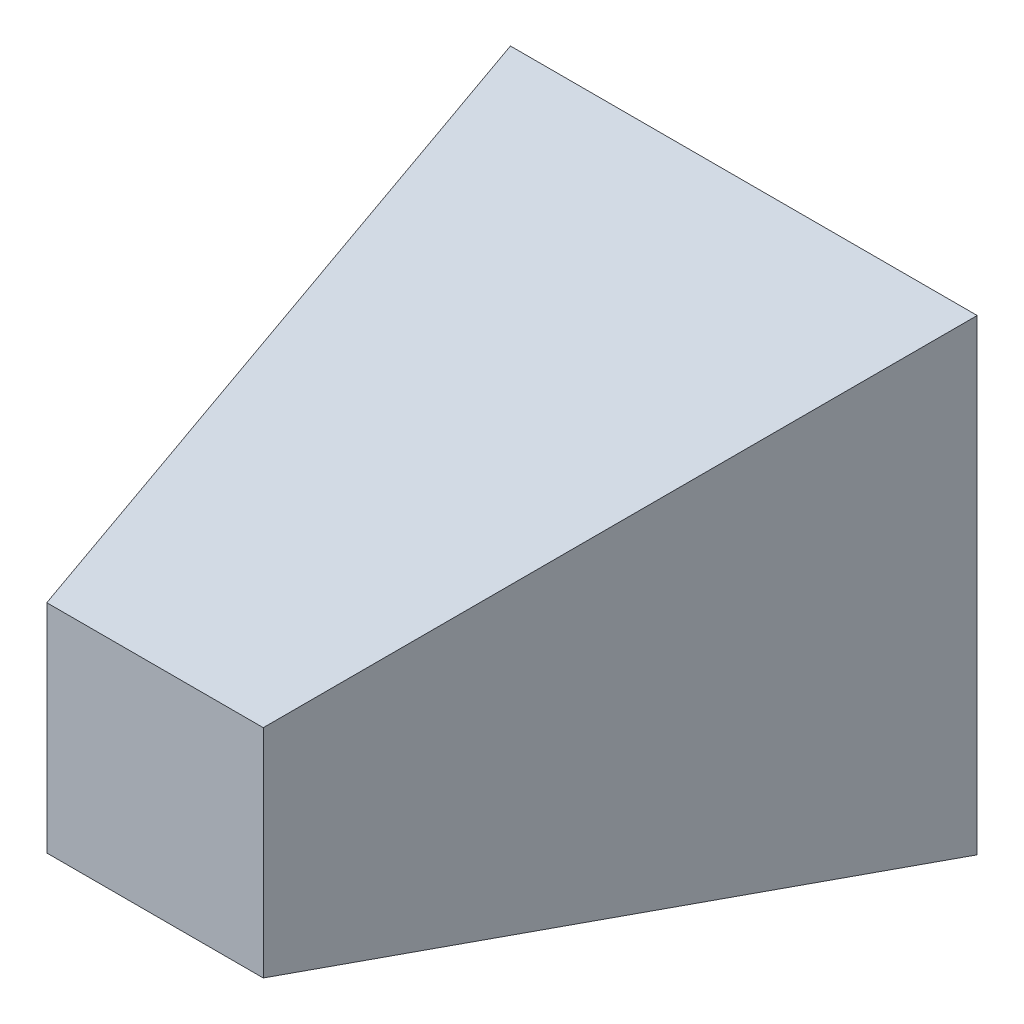
ISO-10303-21;
HEADER;
FILE_DESCRIPTION(('STEP AP214'),'2;1');
FILE_NAME('part.step','',(''),(''),'','','');
FILE_SCHEMA(('AUTOMOTIVE_DESIGN { 1 0 10303 214 1 1 1 1 }'));
ENDSEC;
DATA;
#1=APPLICATION_CONTEXT('core data for automotive mechanical design processes');
#2=APPLICATION_PROTOCOL_DEFINITION('international standard','automotive_design',2000,#1);
#3=PRODUCT_CONTEXT('',#1,'mechanical');
#4=PRODUCT('Part','Part','',(#3));
#5=PRODUCT_RELATED_PRODUCT_CATEGORY('part','',(#4));
#6=PRODUCT_DEFINITION_FORMATION('','',#4);
#7=PRODUCT_DEFINITION_CONTEXT('part definition',#1,'design');
#8=PRODUCT_DEFINITION('design','',#6,#7);
#9=PRODUCT_DEFINITION_SHAPE('','',#8);
#10=(LENGTH_UNIT() NAMED_UNIT(*) SI_UNIT(.MILLI.,.METRE.));
#11=(NAMED_UNIT(*) PLANE_ANGLE_UNIT() SI_UNIT($,.RADIAN.));
#12=(NAMED_UNIT(*) SI_UNIT($,.STERADIAN.) SOLID_ANGLE_UNIT());
#13=UNCERTAINTY_MEASURE_WITH_UNIT(LENGTH_MEASURE(1.E-05),#10,'distance_accuracy_value','');
#14=(GEOMETRIC_REPRESENTATION_CONTEXT(3) GLOBAL_UNCERTAINTY_ASSIGNED_CONTEXT((#13)) GLOBAL_UNIT_ASSIGNED_CONTEXT((#10,
#11,#12)) REPRESENTATION_CONTEXT('',''));
#15=CARTESIAN_POINT('',(0.,0.,0.));
#16=DIRECTION('',(0.,0.,1.));
#17=DIRECTION('',(1.,0.,0.));
#18=AXIS2_PLACEMENT_3D('',#15,#16,#17);
#19=CARTESIAN_POINT('',(-9.243,2.0275,-21.));
#20=DIRECTION('',(-0.978147600733806,0.,0.207911690817759));
#21=DIRECTION('',(0.207911690817759,0.,0.978147600733806));
#22=AXIS2_PLACEMENT_3D('',#19,#20,#21);
#23=PLANE('',#22);
#24=DIRECTION('',(0.,-1.,0.));
#25=VECTOR('',#24,1.);
#26=CARTESIAN_POINT('',(-9.243,2.0275,-21.));
#27=LINE('',#26,#25);
#28=CARTESIAN_POINT('',(-9.243,2.0275,-21.));
#29=VERTEX_POINT('',#28);
#30=CARTESIAN_POINT('',(-9.243,1.39283601788177,-21.));
#31=VERTEX_POINT('',#30);
#32=EDGE_CURVE('E11',#29,#31,#27,.T.);
#33=ORIENTED_EDGE('',*,*,#32,.T.);
#34=DIRECTION('',(-0.203558594952779,-0.203558594952779,-0.957667894857973));
#35=VECTOR('',#34,1.);
#36=CARTESIAN_POINT('',(-9.243,1.39283601788177,-21.));
#37=LINE('',#36,#35);
#38=CARTESIAN_POINT('',(-9.07295475066398,1.56288126721779,-20.2));
#39=VERTEX_POINT('',#38);
#40=EDGE_CURVE('E24',#39,#31,#37,.T.);
#41=ORIENTED_EDGE('',*,*,#40,.F.);
#42=DIRECTION('',(0.,-1.,0.));
#43=VECTOR('',#42,1.);
#44=CARTESIAN_POINT('',(-9.07295475066398,2.0275,-20.2));
#45=LINE('',#44,#43);
#46=CARTESIAN_POINT('',(-9.07295475066398,1.85745475066398,-20.2));
#47=VERTEX_POINT('',#46);
#48=EDGE_CURVE('E88',#47,#39,#45,.T.);
#49=ORIENTED_EDGE('',*,*,#48,.F.);
#50=DIRECTION('',(-0.203558594952779,0.203558594952779,-0.957667894857973));
#51=VECTOR('',#50,1.);
#52=CARTESIAN_POINT('',(-9.243,2.0275,-21.));
#53=LINE('',#52,#51);
#54=EDGE_CURVE('E77',#47,#29,#53,.T.);
#55=ORIENTED_EDGE('',*,*,#54,.T.);
#56=EDGE_LOOP('',(#33,#41,#49,#55));
#57=FACE_BOUND('',#56,.T.);
#58=ADVANCED_FACE('F17',(#57),#23,.T.);
#59=CARTESIAN_POINT('',(-9.243,1.39283601788177,-21.));
#60=DIRECTION('',(0.,-0.978147600733806,0.207911690817759));
#61=DIRECTION('',(0.,-0.207911690817759,-0.978147600733806));
#62=AXIS2_PLACEMENT_3D('',#59,#60,#61);
#63=PLANE('',#62);
#64=DIRECTION('',(1.,0.,0.));
#65=VECTOR('',#64,1.);
#66=CARTESIAN_POINT('',(-9.243,1.39283601788177,-21.));
#67=LINE('',#66,#65);
#68=CARTESIAN_POINT('',(-8.60877044054506,1.39283601788177,-21.));
#69=VERTEX_POINT('',#68);
#70=EDGE_CURVE('E85',#31,#69,#67,.T.);
#71=ORIENTED_EDGE('',*,*,#70,.T.);
#72=DIRECTION('',(0.203558594952779,-0.203558594952779,-0.957667894857973));
#73=VECTOR('',#72,1.);
#74=CARTESIAN_POINT('',(-8.63506844177673,1.41913401911345,-20.8762776315863));
#75=LINE('',#74,#73);
#76=CARTESIAN_POINT('',(-8.77881568988107,1.56288126721779,-20.2));
#77=VERTEX_POINT('',#76);
#78=EDGE_CURVE('E83',#77,#69,#75,.T.);
#79=ORIENTED_EDGE('',*,*,#78,.F.);
#80=DIRECTION('',(1.,0.,0.));
#81=VECTOR('',#80,1.);
#82=CARTESIAN_POINT('',(-9.243,1.56288126721779,-20.2));
#83=LINE('',#82,#81);
#84=EDGE_CURVE('E72',#39,#77,#83,.T.);
#85=ORIENTED_EDGE('',*,*,#84,.F.);
#86=ORIENTED_EDGE('',*,*,#40,.T.);
#87=EDGE_LOOP('',(#71,#79,#85,#86));
#88=FACE_BOUND('',#87,.T.);
#89=ADVANCED_FACE('F90',(#88),#63,.T.);
#90=CARTESIAN_POINT('',(-8.60877044054506,2.0275,-21.));
#91=DIRECTION('',(0.978147600733806,0.,0.207911690817759));
#92=DIRECTION('',(0.207911690817759,0.,-0.978147600733806));
#93=AXIS2_PLACEMENT_3D('',#90,#91,#92);
#94=PLANE('',#93);
#95=DIRECTION('',(0.,1.,0.));
#96=VECTOR('',#95,1.);
#97=CARTESIAN_POINT('',(-8.60877044054506,2.0275,-21.));
#98=LINE('',#97,#96);
#99=CARTESIAN_POINT('',(-8.60877044054506,2.0275,-21.));
#100=VERTEX_POINT('',#99);
#101=EDGE_CURVE('E60',#69,#100,#98,.T.);
#102=ORIENTED_EDGE('',*,*,#101,.T.);
#103=DIRECTION('',(0.203558594952779,0.203558594952779,-0.957667894857973));
#104=VECTOR('',#103,1.);
#105=CARTESIAN_POINT('',(-8.63505044099513,2.00121999954993,-20.8763623186055));
#106=LINE('',#105,#104);
#107=CARTESIAN_POINT('',(-8.77881568988107,1.85745475066398,-20.2));
#108=VERTEX_POINT('',#107);
#109=EDGE_CURVE('E54',#108,#100,#106,.T.);
#110=ORIENTED_EDGE('',*,*,#109,.F.);
#111=DIRECTION('',(0.,1.,0.));
#112=VECTOR('',#111,1.);
#113=CARTESIAN_POINT('',(-8.77881568988107,2.0275,-20.2));
#114=LINE('',#113,#112);
#115=EDGE_CURVE('E58',#77,#108,#114,.T.);
#116=ORIENTED_EDGE('',*,*,#115,.F.);
#117=ORIENTED_EDGE('',*,*,#78,.T.);
#118=EDGE_LOOP('',(#102,#110,#116,#117));
#119=FACE_BOUND('',#118,.T.);
#120=ADVANCED_FACE('F56',(#119),#94,.T.);
#121=CARTESIAN_POINT('',(-9.243,2.0275,-21.));
#122=DIRECTION('',(0.,0.978147600733806,0.207911690817759));
#123=DIRECTION('',(0.,-0.207911690817759,0.978147600733806));
#124=AXIS2_PLACEMENT_3D('',#121,#122,#123);
#125=PLANE('',#124);
#126=DIRECTION('',(-1.,0.,0.));
#127=VECTOR('',#126,1.);
#128=CARTESIAN_POINT('',(-9.243,2.0275,-21.));
#129=LINE('',#128,#127);
#130=EDGE_CURVE('E73',#100,#29,#129,.T.);
#131=ORIENTED_EDGE('',*,*,#130,.T.);
#132=ORIENTED_EDGE('',*,*,#54,.F.);
#133=DIRECTION('',(-1.,0.,0.));
#134=VECTOR('',#133,1.);
#135=CARTESIAN_POINT('',(-9.243,1.85745475066398,-20.2));
#136=LINE('',#135,#134);
#137=EDGE_CURVE('E70',#108,#47,#136,.T.);
#138=ORIENTED_EDGE('',*,*,#137,.F.);
#139=ORIENTED_EDGE('',*,*,#109,.T.);
#140=EDGE_LOOP('',(#131,#132,#138,#139));
#141=FACE_BOUND('',#140,.T.);
#142=ADVANCED_FACE('F76',(#141),#125,.T.);
#143=CARTESIAN_POINT('',(0.,0.,-20.2));
#144=DIRECTION('',(0.,0.,1.));
#145=DIRECTION('',(1.,0.,0.));
#146=AXIS2_PLACEMENT_3D('',#143,#144,#145);
#147=PLANE('',#146);
#148=ORIENTED_EDGE('',*,*,#48,.T.);
#149=ORIENTED_EDGE('',*,*,#84,.T.);
#150=ORIENTED_EDGE('',*,*,#115,.T.);
#151=ORIENTED_EDGE('',*,*,#137,.T.);
#152=EDGE_LOOP('',(#148,#149,#150,#151));
#153=FACE_BOUND('',#152,.T.);
#154=ADVANCED_FACE('F69',(#153),#147,.T.);
#155=CARTESIAN_POINT('',(0.,0.,-21.));
#156=DIRECTION('',(0.,0.,1.));
#157=DIRECTION('',(1.,0.,0.));
#158=AXIS2_PLACEMENT_3D('',#155,#156,#157);
#159=PLANE('',#158);
#160=ORIENTED_EDGE('',*,*,#32,.F.);
#161=ORIENTED_EDGE('',*,*,#130,.F.);
#162=ORIENTED_EDGE('',*,*,#101,.F.);
#163=ORIENTED_EDGE('',*,*,#70,.F.);
#164=EDGE_LOOP('',(#160,#161,#162,#163));
#165=FACE_BOUND('',#164,.T.);
#166=ADVANCED_FACE('F91',(#165),#159,.F.);
#167=CLOSED_SHELL('',(#58,#89,#120,#142,#154,#166));
#168=MANIFOLD_SOLID_BREP('B1',#167);
#169=ADVANCED_BREP_SHAPE_REPRESENTATION('',(#18,#168),#14);
#170=SHAPE_DEFINITION_REPRESENTATION(#9,#169);
ENDSEC;
END-ISO-10303-21;
